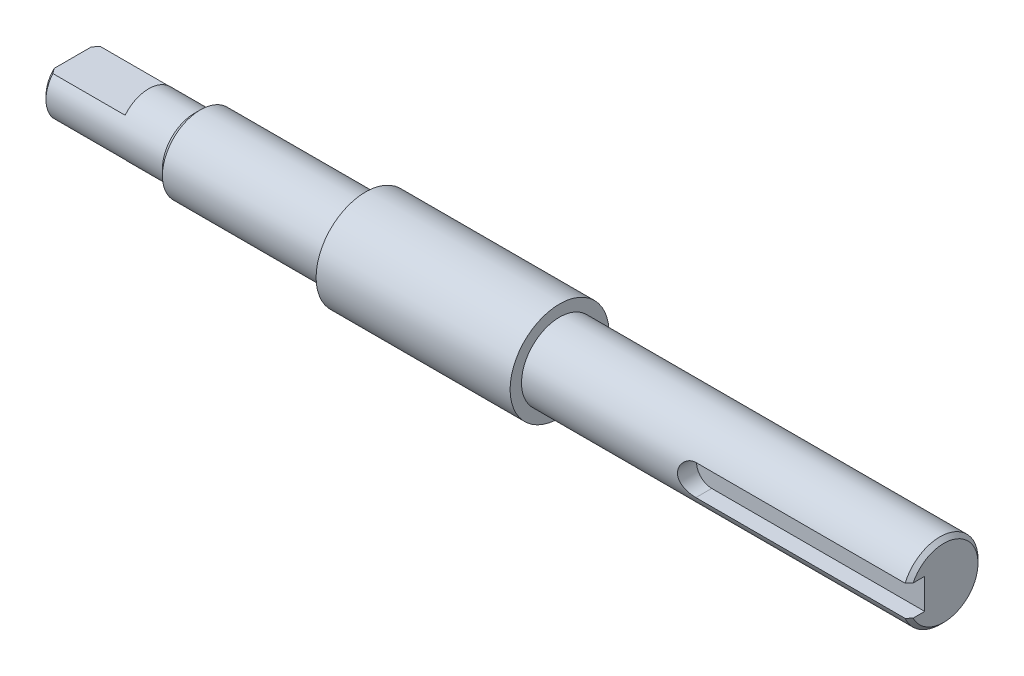
ISO-10303-21;
HEADER;
FILE_DESCRIPTION(('STEP AP214'),'2;1');
FILE_NAME('part.step','',(''),(''),'','','');
FILE_SCHEMA(('AUTOMOTIVE_DESIGN { 1 0 10303 214 1 1 1 1 }'));
ENDSEC;
DATA;
#1=APPLICATION_CONTEXT('core data for automotive mechanical design processes');
#2=APPLICATION_PROTOCOL_DEFINITION('international standard','automotive_design',2000,#1);
#3=PRODUCT_CONTEXT('',#1,'mechanical');
#4=PRODUCT('Part','Part','',(#3));
#5=PRODUCT_RELATED_PRODUCT_CATEGORY('part','',(#4));
#6=PRODUCT_DEFINITION_FORMATION('','',#4);
#7=PRODUCT_DEFINITION_CONTEXT('part definition',#1,'design');
#8=PRODUCT_DEFINITION('design','',#6,#7);
#9=PRODUCT_DEFINITION_SHAPE('','',#8);
#10=(LENGTH_UNIT() NAMED_UNIT(*) SI_UNIT(.MILLI.,.METRE.));
#11=(NAMED_UNIT(*) PLANE_ANGLE_UNIT() SI_UNIT($,.RADIAN.));
#12=(NAMED_UNIT(*) SI_UNIT($,.STERADIAN.) SOLID_ANGLE_UNIT());
#13=UNCERTAINTY_MEASURE_WITH_UNIT(LENGTH_MEASURE(1.E-05),#10,'distance_accuracy_value','');
#14=(GEOMETRIC_REPRESENTATION_CONTEXT(3) GLOBAL_UNCERTAINTY_ASSIGNED_CONTEXT((#13)) GLOBAL_UNIT_ASSIGNED_CONTEXT((#10,
#11,#12)) REPRESENTATION_CONTEXT('',''));
#15=CARTESIAN_POINT('',(0.,0.,0.));
#16=DIRECTION('',(0.,0.,1.));
#17=DIRECTION('',(1.,0.,0.));
#18=AXIS2_PLACEMENT_3D('',#15,#16,#17);
#19=CARTESIAN_POINT('',(-38.5,0.,0.));
#20=DIRECTION('',(1.,0.,0.));
#21=DIRECTION('',(0.,0.,-1.));
#22=AXIS2_PLACEMENT_3D('',#19,#20,#21);
#23=PLANE('',#22);
#24=DIRECTION('',(0.,0.,1.));
#25=VECTOR('',#24,1.);
#26=CARTESIAN_POINT('',(-38.5,2.52784493195291,-3.1));
#27=LINE('',#26,#25);
#28=CARTESIAN_POINT('',(-38.5,2.52784493195291,-2.42074368738205));
#29=VERTEX_POINT('',#28);
#30=CARTESIAN_POINT('',(-38.5,2.52784493195291,2.42074368738204));
#31=VERTEX_POINT('',#30);
#32=EDGE_CURVE('E156',#29,#31,#27,.T.);
#33=ORIENTED_EDGE('',*,*,#32,.F.);
#34=CARTESIAN_POINT('',(-38.5,0.,0.));
#35=DIRECTION('',(1.,0.,0.));
#36=DIRECTION('',(0.,0.,-1.));
#37=AXIS2_PLACEMENT_3D('',#34,#35,#36);
#38=CIRCLE('',#37,3.5);
#39=CARTESIAN_POINT('',(-38.5,-2.52784493195291,-2.42074368738205));
#40=VERTEX_POINT('',#39);
#41=EDGE_CURVE('E334',#29,#40,#38,.F.);
#42=ORIENTED_EDGE('',*,*,#41,.T.);
#43=DIRECTION('',(0.,0.,-1.));
#44=VECTOR('',#43,1.);
#45=CARTESIAN_POINT('',(-38.5,-2.52784493195291,-3.1));
#46=LINE('',#45,#44);
#47=CARTESIAN_POINT('',(-38.5,-2.52784493195291,2.42074368738204));
#48=VERTEX_POINT('',#47);
#49=EDGE_CURVE('E167',#48,#40,#46,.T.);
#50=ORIENTED_EDGE('',*,*,#49,.F.);
#51=CARTESIAN_POINT('',(-38.5,0.,0.));
#52=DIRECTION('',(1.,0.,0.));
#53=DIRECTION('',(0.,0.,-1.));
#54=AXIS2_PLACEMENT_3D('',#51,#52,#53);
#55=CIRCLE('',#54,3.5);
#56=EDGE_CURVE('E332',#48,#31,#55,.F.);
#57=ORIENTED_EDGE('',*,*,#56,.T.);
#58=EDGE_LOOP('',(#33,#42,#50,#57));
#59=FACE_BOUND('',#58,.T.);
#60=ADVANCED_FACE('F36',(#59),#23,.F.);
#61=CARTESIAN_POINT('',(-44.1944651384772,0.,0.));
#62=DIRECTION('',(-1.,0.,0.));
#63=DIRECTION('',(0.,0.,1.));
#64=AXIS2_PLACEMENT_3D('',#61,#62,#63);
#65=CYLINDRICAL_SURFACE('',#64,4.);
#66=DIRECTION('',(-1.,0.,0.));
#67=VECTOR('',#66,1.);
#68=CARTESIAN_POINT('',(-28.5,-2.52784493195291,-3.1));
#69=LINE('',#68,#67);
#70=CARTESIAN_POINT('',(-28.5,-2.52784493195291,-3.1));
#71=VERTEX_POINT('',#70);
#72=CARTESIAN_POINT('',(-38.,-2.52784493195291,-3.1));
#73=VERTEX_POINT('',#72);
#74=EDGE_CURVE('E177',#71,#73,#69,.T.);
#75=ORIENTED_EDGE('',*,*,#74,.T.);
#76=CARTESIAN_POINT('',(-38.,0.,0.));
#77=DIRECTION('',(1.,0.,0.));
#78=DIRECTION('',(0.,0.,-1.));
#79=AXIS2_PLACEMENT_3D('',#76,#77,#78);
#80=CIRCLE('',#79,4.);
#81=CARTESIAN_POINT('',(-38.,2.52784493195291,-3.1));
#82=VERTEX_POINT('',#81);
#83=EDGE_CURVE('E480',#73,#82,#80,.T.);
#84=ORIENTED_EDGE('',*,*,#83,.T.);
#85=DIRECTION('',(-1.,0.,0.));
#86=VECTOR('',#85,1.);
#87=CARTESIAN_POINT('',(-28.5,2.52784493195291,-3.1));
#88=LINE('',#87,#86);
#89=CARTESIAN_POINT('',(-28.5,2.52784493195291,-3.1));
#90=VERTEX_POINT('',#89);
#91=EDGE_CURVE('E161',#90,#82,#88,.T.);
#92=ORIENTED_EDGE('',*,*,#91,.F.);
#93=CARTESIAN_POINT('',(-28.5,0.,0.));
#94=DIRECTION('',(-1.,0.,0.));
#95=DIRECTION('',(0.,0.,1.));
#96=AXIS2_PLACEMENT_3D('',#93,#94,#95);
#97=CIRCLE('',#96,4.);
#98=CARTESIAN_POINT('',(-28.5,2.52784493195291,3.1));
#99=VERTEX_POINT('',#98);
#100=EDGE_CURVE('E157',#99,#90,#97,.T.);
#101=ORIENTED_EDGE('',*,*,#100,.F.);
#102=DIRECTION('',(-1.,0.,0.));
#103=VECTOR('',#102,1.);
#104=CARTESIAN_POINT('',(-28.5,2.52784493195291,3.1));
#105=LINE('',#104,#103);
#106=CARTESIAN_POINT('',(-38.,2.52784493195291,3.1));
#107=VERTEX_POINT('',#106);
#108=EDGE_CURVE('E164',#99,#107,#105,.T.);
#109=ORIENTED_EDGE('',*,*,#108,.T.);
#110=CARTESIAN_POINT('',(-38.,0.,0.));
#111=DIRECTION('',(1.,0.,0.));
#112=DIRECTION('',(0.,0.,-1.));
#113=AXIS2_PLACEMENT_3D('',#110,#111,#112);
#114=CIRCLE('',#113,4.);
#115=CARTESIAN_POINT('',(-38.,-2.52784493195291,3.1));
#116=VERTEX_POINT('',#115);
#117=EDGE_CURVE('E264',#107,#116,#114,.T.);
#118=ORIENTED_EDGE('',*,*,#117,.T.);
#119=DIRECTION('',(-1.,0.,0.));
#120=VECTOR('',#119,1.);
#121=CARTESIAN_POINT('',(-28.5,-2.52784493195291,3.1));
#122=LINE('',#121,#120);
#123=CARTESIAN_POINT('',(-28.5,-2.52784493195291,3.1));
#124=VERTEX_POINT('',#123);
#125=EDGE_CURVE('E174',#124,#116,#122,.T.);
#126=ORIENTED_EDGE('',*,*,#125,.F.);
#127=CARTESIAN_POINT('',(-28.5,0.,0.));
#128=DIRECTION('',(-1.,0.,0.));
#129=DIRECTION('',(0.,0.,1.));
#130=AXIS2_PLACEMENT_3D('',#127,#128,#129);
#131=CIRCLE('',#130,4.);
#132=EDGE_CURVE('E170',#71,#124,#131,.T.);
#133=ORIENTED_EDGE('',*,*,#132,.F.);
#134=EDGE_LOOP('',(#75,#84,#92,#101,#109,#118,#126,#133));
#135=FACE_BOUND('',#134,.T.);
#136=CARTESIAN_POINT('',(-22.5,0.,0.));
#137=DIRECTION('',(-1.,0.,0.));
#138=DIRECTION('',(0.,0.,1.));
#139=AXIS2_PLACEMENT_3D('',#136,#137,#138);
#140=CIRCLE('',#139,4.);
#141=CARTESIAN_POINT('',(-22.5,0.,4.));
#142=VERTEX_POINT('',#141);
#143=EDGE_CURVE('E132',#142,#142,#140,.T.);
#144=ORIENTED_EDGE('',*,*,#143,.T.);
#145=EDGE_LOOP('',(#144));
#146=FACE_BOUND('',#145,.T.);
#147=ADVANCED_FACE('F282',(#135,#146),#65,.T.);
#148=CARTESIAN_POINT('',(-22.5,4.,0.));
#149=DIRECTION('',(1.,0.,0.));
#150=DIRECTION('',(0.,0.,-1.));
#151=AXIS2_PLACEMENT_3D('',#148,#149,#150);
#152=PLANE('',#151);
#153=CARTESIAN_POINT('',(-22.5,0.,0.));
#154=DIRECTION('',(1.,0.,0.));
#155=DIRECTION('',(0.,0.,-1.));
#156=AXIS2_PLACEMENT_3D('',#153,#154,#155);
#157=CIRCLE('',#156,4.19999999999998);
#158=CARTESIAN_POINT('',(-22.5,0.,-4.19999999999998));
#159=VERTEX_POINT('',#158);
#160=EDGE_CURVE('E203',#159,#159,#157,.F.);
#161=ORIENTED_EDGE('',*,*,#160,.T.);
#162=EDGE_LOOP('',(#161));
#163=FACE_BOUND('',#162,.T.);
#164=ORIENTED_EDGE('',*,*,#143,.F.);
#165=EDGE_LOOP('',(#164));
#166=FACE_BOUND('',#165,.T.);
#167=ADVANCED_FACE('F287',(#163,#166),#152,.F.);
#168=CARTESIAN_POINT('',(-44.1944651384772,0.,0.));
#169=DIRECTION('',(-1.,0.,0.));
#170=DIRECTION('',(0.,0.,1.));
#171=AXIS2_PLACEMENT_3D('',#168,#169,#170);
#172=CYLINDRICAL_SURFACE('',#171,5.);
#173=CARTESIAN_POINT('',(-21.7,0.,0.));
#174=DIRECTION('',(1.,0.,0.));
#175=DIRECTION('',(0.,0.,-1.));
#176=AXIS2_PLACEMENT_3D('',#173,#174,#175);
#177=CIRCLE('',#176,5.);
#178=CARTESIAN_POINT('',(-21.7,0.,-5.));
#179=VERTEX_POINT('',#178);
#180=EDGE_CURVE('E337',#179,#179,#177,.T.);
#181=ORIENTED_EDGE('',*,*,#180,.T.);
#182=EDGE_LOOP('',(#181));
#183=FACE_BOUND('',#182,.T.);
#184=CARTESIAN_POINT('',(0.,0.,0.));
#185=DIRECTION('',(-1.,0.,0.));
#186=DIRECTION('',(0.,0.,1.));
#187=AXIS2_PLACEMENT_3D('',#184,#185,#186);
#188=CIRCLE('',#187,5.);
#189=CARTESIAN_POINT('',(0.,0.,5.));
#190=VERTEX_POINT('',#189);
#191=EDGE_CURVE('E191',#190,#190,#188,.T.);
#192=ORIENTED_EDGE('',*,*,#191,.T.);
#193=EDGE_LOOP('',(#192));
#194=FACE_BOUND('',#193,.T.);
#195=ADVANCED_FACE('F294',(#183,#194),#172,.T.);
#196=CARTESIAN_POINT('',(0.,6.5,0.));
#197=DIRECTION('',(1.,0.,0.));
#198=DIRECTION('',(0.,0.,-1.));
#199=AXIS2_PLACEMENT_3D('',#196,#197,#198);
#200=PLANE('',#199);
#201=ORIENTED_EDGE('',*,*,#191,.F.);
#202=EDGE_LOOP('',(#201));
#203=FACE_BOUND('',#202,.T.);
#204=CARTESIAN_POINT('',(0.,0.,0.));
#205=DIRECTION('',(-1.,0.,0.));
#206=DIRECTION('',(0.,0.,1.));
#207=AXIS2_PLACEMENT_3D('',#204,#205,#206);
#208=CIRCLE('',#207,6.5);
#209=CARTESIAN_POINT('',(0.,0.,6.5));
#210=VERTEX_POINT('',#209);
#211=EDGE_CURVE('E188',#210,#210,#208,.T.);
#212=ORIENTED_EDGE('',*,*,#211,.T.);
#213=EDGE_LOOP('',(#212));
#214=FACE_BOUND('',#213,.T.);
#215=ADVANCED_FACE('F298',(#203,#214),#200,.F.);
#216=CARTESIAN_POINT('',(-44.1944651384772,0.,0.));
#217=DIRECTION('',(-1.,0.,0.));
#218=DIRECTION('',(0.,0.,1.));
#219=AXIS2_PLACEMENT_3D('',#216,#217,#218);
#220=CYLINDRICAL_SURFACE('',#219,6.5);
#221=ORIENTED_EDGE('',*,*,#211,.F.);
#222=EDGE_LOOP('',(#221));
#223=FACE_BOUND('',#222,.T.);
#224=CARTESIAN_POINT('',(25.5,0.,0.));
#225=DIRECTION('',(-1.,0.,0.));
#226=DIRECTION('',(0.,0.,1.));
#227=AXIS2_PLACEMENT_3D('',#224,#225,#226);
#228=CIRCLE('',#227,6.5);
#229=CARTESIAN_POINT('',(25.5,0.,6.5));
#230=VERTEX_POINT('',#229);
#231=EDGE_CURVE('E185',#230,#230,#228,.T.);
#232=ORIENTED_EDGE('',*,*,#231,.T.);
#233=EDGE_LOOP('',(#232));
#234=FACE_BOUND('',#233,.T.);
#235=ADVANCED_FACE('F302',(#223,#234),#220,.T.);
#236=CARTESIAN_POINT('',(25.5,6.5,0.));
#237=DIRECTION('',(-1.,0.,0.));
#238=DIRECTION('',(0.,0.,1.));
#239=AXIS2_PLACEMENT_3D('',#236,#237,#238);
#240=PLANE('',#239);
#241=ORIENTED_EDGE('',*,*,#231,.F.);
#242=EDGE_LOOP('',(#241));
#243=FACE_BOUND('',#242,.T.);
#244=CARTESIAN_POINT('',(25.5,0.,0.));
#245=DIRECTION('',(-1.,0.,0.));
#246=DIRECTION('',(0.,0.,1.));
#247=AXIS2_PLACEMENT_3D('',#244,#245,#246);
#248=CIRCLE('',#247,5.);
#249=CARTESIAN_POINT('',(25.5,0.,5.));
#250=VERTEX_POINT('',#249);
#251=EDGE_CURVE('E180',#250,#250,#248,.T.);
#252=ORIENTED_EDGE('',*,*,#251,.T.);
#253=EDGE_LOOP('',(#252));
#254=FACE_BOUND('',#253,.T.);
#255=ADVANCED_FACE('F279',(#243,#254),#240,.F.);
#256=CARTESIAN_POINT('',(-44.1944651384772,0.,0.));
#257=DIRECTION('',(-1.,0.,0.));
#258=DIRECTION('',(0.,0.,1.));
#259=AXIS2_PLACEMENT_3D('',#256,#257,#258);
#260=CYLINDRICAL_SURFACE('',#259,5.);
#261=ORIENTED_EDGE('',*,*,#251,.F.);
#262=EDGE_LOOP('',(#261));
#263=FACE_BOUND('',#262,.T.);
#264=DIRECTION('',(-1.,0.,0.));
#265=VECTOR('',#264,1.);
#266=CARTESIAN_POINT('',(-44.1944651384772,1.99999999999999,4.58257569495584));
#267=LINE('',#266,#265);
#268=CARTESIAN_POINT('',(48.,2.,4.58257569495584));
#269=VERTEX_POINT('',#268);
#270=CARTESIAN_POINT('',(75.5,1.99999999999999,4.58257569495584));
#271=VERTEX_POINT('',#270);
#272=EDGE_CURVE('E150',#269,#271,#267,.F.);
#273=ORIENTED_EDGE('',*,*,#272,.T.);
#274=CARTESIAN_POINT('',(75.5,0.,0.));
#275=DIRECTION('',(-1.,0.,0.));
#276=DIRECTION('',(0.,0.,1.));
#277=AXIS2_PLACEMENT_3D('',#274,#275,#276);
#278=CIRCLE('',#277,5.);
#279=CARTESIAN_POINT('',(75.5,-2.,4.58257569495584));
#280=VERTEX_POINT('',#279);
#281=EDGE_CURVE('E245',#271,#280,#278,.T.);
#282=ORIENTED_EDGE('',*,*,#281,.T.);
#283=DIRECTION('',(-1.,0.,0.));
#284=VECTOR('',#283,1.);
#285=CARTESIAN_POINT('',(-44.1944651384772,-2.,4.58257569495584));
#286=LINE('',#285,#284);
#287=CARTESIAN_POINT('',(48.,-2.,4.58257569495584));
#288=VERTEX_POINT('',#287);
#289=EDGE_CURVE('E153',#280,#288,#286,.T.);
#290=ORIENTED_EDGE('',*,*,#289,.T.);
#291=CARTESIAN_POINT('',(48.,-2.,4.58257569495584));
#292=CARTESIAN_POINT('',(47.9461941474974,-2.00000798036348,4.58256464470381));
#293=CARTESIAN_POINT('',(47.8923943344424,-1.99782891366025,4.58352306077322));
#294=CARTESIAN_POINT('',(47.7852287017453,-1.98915905973447,4.58729625417543));
#295=CARTESIAN_POINT('',(47.731862724644,-1.98266991468793,4.59011032448545));
#296=CARTESIAN_POINT('',(47.6261531784412,-1.9654760367637,4.59749782920639));
#297=CARTESIAN_POINT('',(47.573806415956,-1.95478796820434,4.60206430717532));
#298=CARTESIAN_POINT('',(47.4702992282856,-1.92931630190661,4.61280053296682));
#299=CARTESIAN_POINT('',(47.4191388757229,-1.91453245417091,4.61897037865398));
#300=CARTESIAN_POINT('',(47.2680641494181,-1.86426971793523,4.63959291248421));
#301=CARTESIAN_POINT('',(47.1703457693103,-1.82284489460008,4.6561744915743));
#302=CARTESIAN_POINT('',(46.9832044199174,-1.72548191592177,4.6931237076538));
#303=CARTESIAN_POINT('',(46.8937894470384,-1.66952996336926,4.71349493864007));
#304=CARTESIAN_POINT('',(46.7207376033258,-1.54131835736856,4.75700999402114));
#305=CARTESIAN_POINT('',(46.6376327830798,-1.46836913992731,4.78024245635516));
#306=CARTESIAN_POINT('',(46.4844597277893,-1.3096964617621,4.82612790548655));
#307=CARTESIAN_POINT('',(46.4143941691343,-1.22397038499683,4.8487807724972));
#308=CARTESIAN_POINT('',(46.2865936058044,-1.0380059080897,4.89203417106082));
#309=CARTESIAN_POINT('',(46.2294551907381,-0.937327933050974,4.91251824543531));
#310=CARTESIAN_POINT('',(46.1331559273114,-0.726824143246722,4.94803944125003));
#311=CARTESIAN_POINT('',(46.0939875759483,-0.617002169026255,4.96307883544185));
#312=CARTESIAN_POINT('',(46.0366587986894,-0.3969674412957,4.98538314653816));
#313=CARTESIAN_POINT('',(46.0175730490944,-0.287031054523069,4.99298922547927));
#314=CARTESIAN_POINT('',(45.9979715200544,-0.0652684304565252,5.00080310201086));
#315=CARTESIAN_POINT('',(45.9974491619765,0.0465571232841555,5.0010135205303));
#316=CARTESIAN_POINT('',(46.0144828391599,0.262233376226775,4.99421960045302));
#317=CARTESIAN_POINT('',(46.031025046674,0.366179202506782,4.98761985585461));
#318=CARTESIAN_POINT('',(46.0799934270535,0.569674786500921,4.96849270441446));
#319=CARTESIAN_POINT('',(46.1124204988686,0.669224295072834,4.95596496209929));
#320=CARTESIAN_POINT('',(46.1926362964245,0.862897539070286,4.92596830598785));
#321=CARTESIAN_POINT('',(46.2406492408105,0.956916851366429,4.90842774755848));
#322=CARTESIAN_POINT('',(46.3504645885952,1.13580746919775,4.87014602008043));
#323=CARTESIAN_POINT('',(46.4122718296906,1.22067554984697,4.84940372896449));
#324=CARTESIAN_POINT('',(46.5526441802585,1.38476339273626,4.80521782746144));
#325=CARTESIAN_POINT('',(46.63204247467,1.46324770308939,4.78168627172885));
#326=CARTESIAN_POINT('',(46.8029800951477,1.60609926099477,4.7356195058465));
#327=CARTESIAN_POINT('',(46.8945249220943,1.67046007709005,4.71308475332783));
#328=CARTESIAN_POINT('',(47.0904702840212,1.78493657933605,4.67095688856025));
#329=CARTESIAN_POINT('',(47.1951648366602,1.83458932217621,4.65146702150583));
#330=CARTESIAN_POINT('',(47.4123615244295,1.91521298357264,4.61886105059582));
#331=CARTESIAN_POINT('',(47.5248494473383,1.94621696002207,4.60573367628738));
#332=CARTESIAN_POINT('',(47.698743634158,1.9781058182572,4.59208303529493));
#333=CARTESIAN_POINT('',(47.7586575493013,1.98630505165979,4.58853437680526));
#334=CARTESIAN_POINT('',(47.8790350189956,1.99725282103811,4.58377540314389));
#335=CARTESIAN_POINT('',(47.9394982117579,2.00000471568568,4.58256364711745));
#336=CARTESIAN_POINT('',(48.,2.,4.58257569495584));
#337=B_SPLINE_CURVE_WITH_KNOTS('',3,(#291,#292,#293,#294,#295,#296,#297,#298,#299,#300,#301,
#302,#303,#304,#305,#306,#307,#308,#309,#310,#311,#312,#313,#314,#315,#316,#317,#318,#319,#320,
#321,#322,#323,#324,#325,#326,#327,#328,#329,#330,#331,#332,#333,#334,#335,#336),.UNSPECIFIED.,
.F.,.F.,(4,2,2,2,2,2,2,2,2,2,2,2,2,2,2,2,2,2,2,2,2,2,4),(0.,0.161354853098824,0.322648263883208,
0.483307911251876,0.643977367092303,0.964683001739086,1.28569434942625,1.62318047995497,
1.9607358053919,2.31162858925763,2.66237473197322,2.99613876504269,3.32978451514655,
3.64468915259534,3.95961161305654,4.27928176927546,4.59906421133018,4.93981874675152,
5.28072813203933,5.63144241548461,5.98153315592124,6.16300192557814,6.34435877193561),.UNSPECIFIED.);
#338=EDGE_CURVE('E131',#288,#269,#337,.T.);
#339=ORIENTED_EDGE('',*,*,#338,.T.);
#340=EDGE_LOOP('',(#273,#282,#290,#339));
#341=FACE_BOUND('',#340,.T.);
#342=ADVANCED_FACE('F205',(#263,#341),#260,.T.);
#343=CARTESIAN_POINT('',(76.,5.,0.));
#344=DIRECTION('',(-1.,0.,0.));
#345=DIRECTION('',(0.,0.,1.));
#346=AXIS2_PLACEMENT_3D('',#343,#344,#345);
#347=PLANE('',#346);
#348=DIRECTION('',(0.,0.,1.));
#349=VECTOR('',#348,1.);
#350=CARTESIAN_POINT('',(76.,-2.,2.5));
#351=LINE('',#350,#349);
#352=CARTESIAN_POINT('',(76.,-2.,2.5));
#353=VERTEX_POINT('',#352);
#354=CARTESIAN_POINT('',(76.,-2.,4.03112887414928));
#355=VERTEX_POINT('',#354);
#356=EDGE_CURVE('E154',#353,#355,#351,.T.);
#357=ORIENTED_EDGE('',*,*,#356,.T.);
#358=CARTESIAN_POINT('',(76.,0.,0.));
#359=DIRECTION('',(-1.,0.,0.));
#360=DIRECTION('',(0.,0.,1.));
#361=AXIS2_PLACEMENT_3D('',#358,#359,#360);
#362=CIRCLE('',#361,4.5);
#363=CARTESIAN_POINT('',(76.,2.,4.03112887414928));
#364=VERTEX_POINT('',#363);
#365=EDGE_CURVE('E49',#355,#364,#362,.F.);
#366=ORIENTED_EDGE('',*,*,#365,.T.);
#367=DIRECTION('',(0.,0.,1.));
#368=VECTOR('',#367,1.);
#369=CARTESIAN_POINT('',(76.,2.,2.5));
#370=LINE('',#369,#368);
#371=CARTESIAN_POINT('',(76.,2.,2.5));
#372=VERTEX_POINT('',#371);
#373=EDGE_CURVE('E136',#372,#364,#370,.T.);
#374=ORIENTED_EDGE('',*,*,#373,.F.);
#375=DIRECTION('',(0.,1.,0.));
#376=VECTOR('',#375,1.);
#377=CARTESIAN_POINT('',(76.,5.,2.5));
#378=LINE('',#377,#376);
#379=EDGE_CURVE('E124',#353,#372,#378,.T.);
#380=ORIENTED_EDGE('',*,*,#379,.F.);
#381=EDGE_LOOP('',(#357,#366,#374,#380));
#382=FACE_BOUND('',#381,.T.);
#383=ADVANCED_FACE('F143',(#382),#347,.F.);
#384=CARTESIAN_POINT('',(-28.5,-2.52784493195291,-3.1));
#385=DIRECTION('',(0.,1.,0.));
#386=DIRECTION('',(0.,0.,1.));
#387=AXIS2_PLACEMENT_3D('',#384,#385,#386);
#388=PLANE('',#387);
#389=ORIENTED_EDGE('',*,*,#49,.T.);
#390=CARTESIAN_POINT('',(-38.5,-2.52784493195291,-2.42074368738204));
#391=CARTESIAN_POINT('',(-38.4600047721838,-2.52784493195291,-2.47856292534061));
#392=CARTESIAN_POINT('',(-38.4195122650444,-2.52784493195291,-2.53603534659571));
#393=CARTESIAN_POINT('',(-38.3376610836858,-2.52784493195291,-2.65034469361215));
#394=CARTESIAN_POINT('',(-38.2963025681697,-2.52784493195291,-2.70718173293418));
#395=CARTESIAN_POINT('',(-38.2128346405951,-2.52784493195291,-2.82029738120061));
#396=CARTESIAN_POINT('',(-38.1707252555723,-2.52784493195291,-2.87657601013795));
#397=CARTESIAN_POINT('',(-38.0858386714917,-2.52784493195291,-2.98864369868627));
#398=CARTESIAN_POINT('',(-38.0430613525939,-2.52784493195291,-3.0444326675717));
#399=CARTESIAN_POINT('',(-38.,-2.52784493195291,-3.1));
#400=B_SPLINE_CURVE_WITH_KNOTS('',3,(#390,#391,#392,#393,#394,#395,#396,#397,#398,#399),
.UNSPECIFIED.,.F.,.F.,(4,2,2,2,4),(0.,0.210906678483617,0.421775039131133,0.632635822549874,
0.843534883310969),.UNSPECIFIED.);
#401=EDGE_CURVE('E258',#40,#73,#400,.T.);
#402=ORIENTED_EDGE('',*,*,#401,.T.);
#403=ORIENTED_EDGE('',*,*,#74,.F.);
#404=DIRECTION('',(0.,0.,-1.));
#405=VECTOR('',#404,1.);
#406=CARTESIAN_POINT('',(-28.5,-2.52784493195291,-3.1));
#407=LINE('',#406,#405);
#408=EDGE_CURVE('E172',#124,#71,#407,.T.);
#409=ORIENTED_EDGE('',*,*,#408,.F.);
#410=ORIENTED_EDGE('',*,*,#125,.T.);
#411=CARTESIAN_POINT('',(-38.,-2.52784493195291,3.1));
#412=CARTESIAN_POINT('',(-38.0430613525939,-2.52784493195291,3.0444326675717));
#413=CARTESIAN_POINT('',(-38.0858386714917,-2.52784493195291,2.98864369868627));
#414=CARTESIAN_POINT('',(-38.1707252555723,-2.52784493195291,2.87657601013795));
#415=CARTESIAN_POINT('',(-38.2128346405951,-2.52784493195291,2.82029738120061));
#416=CARTESIAN_POINT('',(-38.2963025681697,-2.52784493195291,2.70718173293418));
#417=CARTESIAN_POINT('',(-38.3376610836858,-2.52784493195291,2.65034469361215));
#418=CARTESIAN_POINT('',(-38.4195122650444,-2.52784493195291,2.53603534659571));
#419=CARTESIAN_POINT('',(-38.4600047721838,-2.52784493195291,2.47856292534061));
#420=CARTESIAN_POINT('',(-38.5,-2.52784493195291,2.42074368738204));
#421=B_SPLINE_CURVE_WITH_KNOTS('',3,(#411,#412,#413,#414,#415,#416,#417,#418,#419,#420),
.UNSPECIFIED.,.F.,.F.,(4,2,2,2,4),(0.,0.210899060761094,0.421759844179836,0.632628204827351,
0.843534883310969),.UNSPECIFIED.);
#422=EDGE_CURVE('E265',#116,#48,#421,.T.);
#423=ORIENTED_EDGE('',*,*,#422,.T.);
#424=EDGE_LOOP('',(#389,#402,#403,#409,#410,#423));
#425=FACE_BOUND('',#424,.T.);
#426=ADVANCED_FACE('F270',(#425),#388,.F.);
#427=CARTESIAN_POINT('',(-28.5,0.,0.));
#428=DIRECTION('',(-1.,0.,0.));
#429=DIRECTION('',(0.,0.,1.));
#430=AXIS2_PLACEMENT_3D('',#427,#428,#429);
#431=PLANE('',#430);
#432=ORIENTED_EDGE('',*,*,#132,.T.);
#433=ORIENTED_EDGE('',*,*,#408,.T.);
#434=EDGE_LOOP('',(#432,#433));
#435=FACE_BOUND('',#434,.T.);
#436=ADVANCED_FACE('F228',(#435),#431,.T.);
#437=CARTESIAN_POINT('',(-28.5,2.52784493195291,-3.1));
#438=DIRECTION('',(0.,-1.,0.));
#439=DIRECTION('',(0.,0.,-1.));
#440=AXIS2_PLACEMENT_3D('',#437,#438,#439);
#441=PLANE('',#440);
#442=ORIENTED_EDGE('',*,*,#91,.T.);
#443=CARTESIAN_POINT('',(-38.,2.52784493195291,-3.1));
#444=CARTESIAN_POINT('',(-38.0430613525939,2.52784493195291,-3.0444326675717));
#445=CARTESIAN_POINT('',(-38.0858386714917,2.52784493195291,-2.98864369868627));
#446=CARTESIAN_POINT('',(-38.1707252555723,2.52784493195291,-2.87657601013795));
#447=CARTESIAN_POINT('',(-38.2128346405951,2.52784493195291,-2.82029738120061));
#448=CARTESIAN_POINT('',(-38.2963025681697,2.52784493195291,-2.70718173293418));
#449=CARTESIAN_POINT('',(-38.3376610836858,2.52784493195291,-2.65034469361215));
#450=CARTESIAN_POINT('',(-38.4195122650444,2.52784493195291,-2.53603534659571));
#451=CARTESIAN_POINT('',(-38.4600047721838,2.52784493195291,-2.47856292534061));
#452=CARTESIAN_POINT('',(-38.5,2.52784493195291,-2.42074368738204));
#453=B_SPLINE_CURVE_WITH_KNOTS('',3,(#443,#444,#445,#446,#447,#448,#449,#450,#451,#452),
.UNSPECIFIED.,.F.,.F.,(4,2,2,2,4),(0.,0.210899060761094,0.421759844179836,0.632628204827351,
0.843534883310969),.UNSPECIFIED.);
#454=EDGE_CURVE('E239',#82,#29,#453,.T.);
#455=ORIENTED_EDGE('',*,*,#454,.T.);
#456=ORIENTED_EDGE('',*,*,#32,.T.);
#457=CARTESIAN_POINT('',(-38.5,2.52784493195291,2.42074368738204));
#458=CARTESIAN_POINT('',(-38.4600047721838,2.52784493195291,2.47856292534061));
#459=CARTESIAN_POINT('',(-38.4195122650444,2.52784493195291,2.53603534659571));
#460=CARTESIAN_POINT('',(-38.3376610836858,2.52784493195291,2.65034469361215));
#461=CARTESIAN_POINT('',(-38.2963025681697,2.52784493195291,2.70718173293418));
#462=CARTESIAN_POINT('',(-38.2128346405951,2.52784493195291,2.82029738120061));
#463=CARTESIAN_POINT('',(-38.1707252555723,2.52784493195291,2.87657601013795));
#464=CARTESIAN_POINT('',(-38.0858386714917,2.52784493195291,2.98864369868627));
#465=CARTESIAN_POINT('',(-38.0430613525939,2.52784493195291,3.0444326675717));
#466=CARTESIAN_POINT('',(-38.,2.52784493195291,3.1));
#467=B_SPLINE_CURVE_WITH_KNOTS('',3,(#457,#458,#459,#460,#461,#462,#463,#464,#465,#466),
.UNSPECIFIED.,.F.,.F.,(4,2,2,2,4),(0.,0.210906678483617,0.421775039131133,0.632635822549874,
0.843534883310969),.UNSPECIFIED.);
#468=EDGE_CURVE('E233',#31,#107,#467,.T.);
#469=ORIENTED_EDGE('',*,*,#468,.T.);
#470=ORIENTED_EDGE('',*,*,#108,.F.);
#471=DIRECTION('',(0.,0.,1.));
#472=VECTOR('',#471,1.);
#473=CARTESIAN_POINT('',(-28.5,2.52784493195291,-3.1));
#474=LINE('',#473,#472);
#475=EDGE_CURVE('E159',#90,#99,#474,.T.);
#476=ORIENTED_EDGE('',*,*,#475,.F.);
#477=EDGE_LOOP('',(#442,#455,#456,#469,#470,#476));
#478=FACE_BOUND('',#477,.T.);
#479=ADVANCED_FACE('F223',(#478),#441,.F.);
#480=CARTESIAN_POINT('',(-28.5,0.,0.));
#481=DIRECTION('',(-1.,0.,0.));
#482=DIRECTION('',(0.,0.,1.));
#483=AXIS2_PLACEMENT_3D('',#480,#481,#482);
#484=PLANE('',#483);
#485=ORIENTED_EDGE('',*,*,#100,.T.);
#486=ORIENTED_EDGE('',*,*,#475,.T.);
#487=EDGE_LOOP('',(#485,#486));
#488=FACE_BOUND('',#487,.T.);
#489=ADVANCED_FACE('F214',(#488),#484,.T.);
#490=CARTESIAN_POINT('',(48.,0.,2.5));
#491=DIRECTION('',(0.,0.,1.));
#492=DIRECTION('',(1.,0.,0.));
#493=AXIS2_PLACEMENT_3D('',#490,#491,#492);
#494=CYLINDRICAL_SURFACE('',#493,2.);
#495=DIRECTION('',(0.,0.,1.));
#496=VECTOR('',#495,1.);
#497=CARTESIAN_POINT('',(48.,-2.,2.5));
#498=LINE('',#497,#496);
#499=CARTESIAN_POINT('',(48.,-2.,2.5));
#500=VERTEX_POINT('',#499);
#501=EDGE_CURVE('E145',#500,#288,#498,.T.);
#502=ORIENTED_EDGE('',*,*,#501,.F.);
#503=CARTESIAN_POINT('',(48.,0.,2.5));
#504=DIRECTION('',(0.,0.,1.));
#505=DIRECTION('',(1.,0.,0.));
#506=AXIS2_PLACEMENT_3D('',#503,#504,#505);
#507=CIRCLE('',#506,2.);
#508=CARTESIAN_POINT('',(48.,2.,2.5));
#509=VERTEX_POINT('',#508);
#510=EDGE_CURVE('E141',#509,#500,#507,.T.);
#511=ORIENTED_EDGE('',*,*,#510,.F.);
#512=DIRECTION('',(0.,0.,1.));
#513=VECTOR('',#512,1.);
#514=CARTESIAN_POINT('',(48.,2.,2.5));
#515=LINE('',#514,#513);
#516=EDGE_CURVE('E139',#509,#269,#515,.T.);
#517=ORIENTED_EDGE('',*,*,#516,.T.);
#518=ORIENTED_EDGE('',*,*,#338,.F.);
#519=EDGE_LOOP('',(#502,#511,#517,#518));
#520=FACE_BOUND('',#519,.T.);
#521=ADVANCED_FACE('F209',(#520),#494,.F.);
#522=CARTESIAN_POINT('',(76.,-2.,2.5));
#523=DIRECTION('',(0.,-1.,0.));
#524=DIRECTION('',(0.,0.,-1.));
#525=AXIS2_PLACEMENT_3D('',#522,#523,#524);
#526=PLANE('',#525);
#527=ORIENTED_EDGE('',*,*,#289,.F.);
#528=CARTESIAN_POINT('',(75.5,-2.,4.58257569495584));
#529=CARTESIAN_POINT('',(75.5419124295061,-2.,4.53684512327981));
#530=CARTESIAN_POINT('',(75.5837706865717,-2.,4.4910648538992));
#531=CARTESIAN_POINT('',(75.6673679301638,-2.,4.39939622920809));
#532=CARTESIAN_POINT('',(75.7091069176462,-2.,4.35350787476923));
#533=CARTESIAN_POINT('',(75.7924554201815,-2.,4.26161359983418));
#534=CARTESIAN_POINT('',(75.8340649350799,-2.,4.21560767919779));
#535=CARTESIAN_POINT('',(75.9171421102884,-2.,4.12346727656414));
#536=CARTESIAN_POINT('',(75.9586097694553,-2.,4.07733279353623));
#537=CARTESIAN_POINT('',(76.,-2.,4.03112887414928));
#538=B_SPLINE_CURVE_WITH_KNOTS('',3,(#528,#529,#530,#531,#532,#533,#534,#535,#536,#537),
.UNSPECIFIED.,.F.,.F.,(4,2,2,2,4),(0.,0.186095231389279,0.372188967110217,0.558282924839071,
0.744378378749964),.UNSPECIFIED.);
#539=EDGE_CURVE('E63',#280,#355,#538,.T.);
#540=ORIENTED_EDGE('',*,*,#539,.T.);
#541=ORIENTED_EDGE('',*,*,#356,.F.);
#542=DIRECTION('',(1.,0.,0.));
#543=VECTOR('',#542,1.);
#544=CARTESIAN_POINT('',(76.,-2.,2.5));
#545=LINE('',#544,#543);
#546=EDGE_CURVE('E130',#500,#353,#545,.T.);
#547=ORIENTED_EDGE('',*,*,#546,.F.);
#548=ORIENTED_EDGE('',*,*,#501,.T.);
#549=EDGE_LOOP('',(#527,#540,#541,#547,#548));
#550=FACE_BOUND('',#549,.T.);
#551=ADVANCED_FACE('F213',(#550),#526,.F.);
#552=CARTESIAN_POINT('',(76.,2.,2.5));
#553=DIRECTION('',(0.,1.,0.));
#554=DIRECTION('',(-1.,0.,0.));
#555=AXIS2_PLACEMENT_3D('',#552,#553,#554);
#556=PLANE('',#555);
#557=ORIENTED_EDGE('',*,*,#373,.T.);
#558=CARTESIAN_POINT('',(76.,2.,4.03112887414928));
#559=CARTESIAN_POINT('',(75.9586097694553,2.,4.07733279353623));
#560=CARTESIAN_POINT('',(75.9171421102883,2.,4.12346727656414));
#561=CARTESIAN_POINT('',(75.8340649350799,2.,4.21560767919779));
#562=CARTESIAN_POINT('',(75.7924554201815,2.,4.26161359983418));
#563=CARTESIAN_POINT('',(75.7091069176462,2.,4.35350787476924));
#564=CARTESIAN_POINT('',(75.6673679301638,2.,4.39939622920809));
#565=CARTESIAN_POINT('',(75.5837706865717,2.,4.49106485389921));
#566=CARTESIAN_POINT('',(75.5419124295061,2.,4.53684512327982));
#567=CARTESIAN_POINT('',(75.5,2.,4.58257569495585));
#568=B_SPLINE_CURVE_WITH_KNOTS('',3,(#558,#559,#560,#561,#562,#563,#564,#565,#566,#567),
.UNSPECIFIED.,.F.,.F.,(4,2,2,2,4),(0.,0.186095453910902,0.372189411639746,0.558283147360685,
0.744378378749966),.UNSPECIFIED.);
#569=EDGE_CURVE('E11',#364,#271,#568,.T.);
#570=ORIENTED_EDGE('',*,*,#569,.T.);
#571=ORIENTED_EDGE('',*,*,#272,.F.);
#572=ORIENTED_EDGE('',*,*,#516,.F.);
#573=DIRECTION('',(-1.,0.,0.));
#574=VECTOR('',#573,1.);
#575=CARTESIAN_POINT('',(76.,2.,2.5));
#576=LINE('',#575,#574);
#577=EDGE_CURVE('E128',#372,#509,#576,.T.);
#578=ORIENTED_EDGE('',*,*,#577,.F.);
#579=EDGE_LOOP('',(#557,#570,#571,#572,#578));
#580=FACE_BOUND('',#579,.T.);
#581=ADVANCED_FACE('F135',(#580),#556,.F.);
#582=CARTESIAN_POINT('',(76.,0.,2.5));
#583=DIRECTION('',(0.,0.,1.));
#584=DIRECTION('',(1.,0.,0.));
#585=AXIS2_PLACEMENT_3D('',#582,#583,#584);
#586=PLANE('',#585);
#587=ORIENTED_EDGE('',*,*,#379,.T.);
#588=ORIENTED_EDGE('',*,*,#577,.T.);
#589=ORIENTED_EDGE('',*,*,#510,.T.);
#590=ORIENTED_EDGE('',*,*,#546,.T.);
#591=EDGE_LOOP('',(#587,#588,#589,#590));
#592=FACE_BOUND('',#591,.T.);
#593=ADVANCED_FACE('F126',(#592),#586,.T.);
#594=CARTESIAN_POINT('',(-22.5,0.,0.));
#595=DIRECTION('',(1.,0.,0.));
#596=DIRECTION('',(0.,0.,-1.));
#597=AXIS2_PLACEMENT_3D('',#594,#595,#596);
#598=CONICAL_SURFACE('',#597,4.19999999999998,0.785398163397448);
#599=CARTESIAN_POINT('',(-21.7,0.,-5.));
#600=CARTESIAN_POINT('',(-21.7083333333333,0.,-4.99166666666666));
#601=CARTESIAN_POINT('',(-21.7166666666666,0.,-4.98333333333333));
#602=CARTESIAN_POINT('',(-21.7333333333333,0.,-4.96666666666666));
#603=CARTESIAN_POINT('',(-21.7416666666666,0.,-4.95833333333333));
#604=CARTESIAN_POINT('',(-21.7583333333333,0.,-4.94166666666666));
#605=CARTESIAN_POINT('',(-21.7666666666666,0.,-4.93333333333333));
#606=CARTESIAN_POINT('',(-21.7833333333333,0.,-4.91666666666666));
#607=CARTESIAN_POINT('',(-21.7916666666667,0.,-4.90833333333333));
#608=CARTESIAN_POINT('',(-21.8083333333333,0.,-4.89166666666666));
#609=CARTESIAN_POINT('',(-21.8166666666667,0.,-4.88333333333333));
#610=CARTESIAN_POINT('',(-21.8333333333333,0.,-4.86666666666666));
#611=CARTESIAN_POINT('',(-21.8416666666667,0.,-4.85833333333333));
#612=CARTESIAN_POINT('',(-21.8583333333333,0.,-4.84166666666666));
#613=CARTESIAN_POINT('',(-21.8666666666667,0.,-4.83333333333333));
#614=CARTESIAN_POINT('',(-21.8833333333333,0.,-4.81666666666666));
#615=CARTESIAN_POINT('',(-21.8916666666667,0.,-4.80833333333333));
#616=CARTESIAN_POINT('',(-21.9083333333333,0.,-4.79166666666666));
#617=CARTESIAN_POINT('',(-21.9166666666667,0.,-4.78333333333333));
#618=CARTESIAN_POINT('',(-21.9333333333333,0.,-4.76666666666666));
#619=CARTESIAN_POINT('',(-21.9416666666667,0.,-4.75833333333333));
#620=CARTESIAN_POINT('',(-21.9583333333333,0.,-4.74166666666666));
#621=CARTESIAN_POINT('',(-21.9666666666667,0.,-4.73333333333333));
#622=CARTESIAN_POINT('',(-21.9833333333333,0.,-4.71666666666666));
#623=CARTESIAN_POINT('',(-21.9916666666667,0.,-4.70833333333333));
#624=CARTESIAN_POINT('',(-22.0083333333333,0.,-4.69166666666666));
#625=CARTESIAN_POINT('',(-22.0166666666667,0.,-4.68333333333332));
#626=CARTESIAN_POINT('',(-22.0333333333333,0.,-4.66666666666666));
#627=CARTESIAN_POINT('',(-22.0416666666667,0.,-4.65833333333332));
#628=CARTESIAN_POINT('',(-22.0583333333333,0.,-4.64166666666666));
#629=CARTESIAN_POINT('',(-22.0666666666667,0.,-4.63333333333332));
#630=CARTESIAN_POINT('',(-22.0833333333333,0.,-4.61666666666666));
#631=CARTESIAN_POINT('',(-22.0916666666667,0.,-4.60833333333332));
#632=CARTESIAN_POINT('',(-22.1083333333333,0.,-4.59166666666666));
#633=CARTESIAN_POINT('',(-22.1166666666667,0.,-4.58333333333332));
#634=CARTESIAN_POINT('',(-22.1333333333333,0.,-4.56666666666666));
#635=CARTESIAN_POINT('',(-22.1416666666667,0.,-4.55833333333332));
#636=CARTESIAN_POINT('',(-22.1583333333333,0.,-4.54166666666665));
#637=CARTESIAN_POINT('',(-22.1666666666667,0.,-4.53333333333332));
#638=CARTESIAN_POINT('',(-22.1833333333333,0.,-4.51666666666665));
#639=CARTESIAN_POINT('',(-22.1916666666667,0.,-4.50833333333332));
#640=CARTESIAN_POINT('',(-22.2083333333333,0.,-4.49166666666665));
#641=CARTESIAN_POINT('',(-22.2166666666667,0.,-4.48333333333332));
#642=CARTESIAN_POINT('',(-22.2333333333333,0.,-4.46666666666665));
#643=CARTESIAN_POINT('',(-22.2416666666667,0.,-4.45833333333332));
#644=CARTESIAN_POINT('',(-22.2583333333333,0.,-4.44166666666665));
#645=CARTESIAN_POINT('',(-22.2666666666667,0.,-4.43333333333332));
#646=CARTESIAN_POINT('',(-22.2833333333333,0.,-4.41666666666665));
#647=CARTESIAN_POINT('',(-22.2916666666667,0.,-4.40833333333332));
#648=CARTESIAN_POINT('',(-22.3083333333333,0.,-4.39166666666665));
#649=CARTESIAN_POINT('',(-22.3166666666667,0.,-4.38333333333332));
#650=CARTESIAN_POINT('',(-22.3333333333333,0.,-4.36666666666665));
#651=CARTESIAN_POINT('',(-22.3416666666667,0.,-4.35833333333332));
#652=CARTESIAN_POINT('',(-22.3583333333333,0.,-4.34166666666665));
#653=CARTESIAN_POINT('',(-22.3666666666667,0.,-4.33333333333332));
#654=CARTESIAN_POINT('',(-22.3833333333333,0.,-4.31666666666665));
#655=CARTESIAN_POINT('',(-22.3916666666667,0.,-4.30833333333331));
#656=CARTESIAN_POINT('',(-22.4083333333333,0.,-4.29166666666665));
#657=CARTESIAN_POINT('',(-22.4166666666667,0.,-4.28333333333332));
#658=CARTESIAN_POINT('',(-22.4333333333333,0.,-4.26666666666665));
#659=CARTESIAN_POINT('',(-22.4416666666667,0.,-4.25833333333331));
#660=CARTESIAN_POINT('',(-22.4583333333333,0.,-4.24166666666665));
#661=CARTESIAN_POINT('',(-22.4666666666667,0.,-4.23333333333331));
#662=CARTESIAN_POINT('',(-22.4833333333333,0.,-4.21666666666665));
#663=CARTESIAN_POINT('',(-22.4916666666667,0.,-4.20833333333331));
#664=CARTESIAN_POINT('',(-22.5,0.,-4.19999999999998));
#665=B_SPLINE_CURVE_WITH_KNOTS('',3,(#599,#600,#601,#602,#603,#604,#605,#606,#607,#608,#609,
#610,#611,#612,#613,#614,#615,#616,#617,#618,#619,#620,#621,#622,#623,#624,#625,#626,#627,#628,
#629,#630,#631,#632,#633,#634,#635,#636,#637,#638,#639,#640,#641,#642,#643,#644,#645,#646,#647,
#648,#649,#650,#651,#652,#653,#654,#655,#656,#657,#658,#659,#660,#661,#662,#663,#664),
.UNSPECIFIED.,.F.,.F.,(4,2,2,2,2,2,2,2,2,2,2,2,2,2,2,2,2,2,2,2,2,2,2,2,2,2,2,2,2,2,2,2,4),(0.,
0.0353553390593284,0.0707106781186562,0.106066017177985,0.141421356237313,0.176776695296641,
0.21213203435597,0.247487373415298,0.282842712474627,0.318198051533955,0.353553390593283,
0.388908729652611,0.42426406871194,0.459619407771268,0.494974746830596,0.530330085889925,
0.565685424949252,0.601040764008581,0.636396103067909,0.671751442127238,0.707106781186566,
0.742462120245894,0.777817459305222,0.813172798364551,0.848528137423879,0.883883476483207,
0.919238815542536,0.954594154601864,0.989949493661193,1.02530483272052,1.06066017177985,
1.09601551083918,1.1313708498985),.UNSPECIFIED.);
#666=EDGE_CURVE('BSEAM252',#179,#159,#665,.T.);
#667=ORIENTED_EDGE('',*,*,#180,.F.);
#668=ORIENTED_EDGE('',*,*,#160,.F.);
#669=ORIENTED_EDGE('',*,*,#666,.T.);
#670=ORIENTED_EDGE('',*,*,#666,.F.);
#671=EDGE_LOOP('',(#667,#669,#668,#670));
#672=FACE_BOUND('',#671,.T.);
#673=ADVANCED_FACE('F252',(#672),#598,.T.);
#674=CARTESIAN_POINT('',(-38.5,0.,0.));
#675=DIRECTION('',(1.,0.,0.));
#676=DIRECTION('',(0.,0.,-1.));
#677=AXIS2_PLACEMENT_3D('',#674,#675,#676);
#678=CONICAL_SURFACE('',#677,3.5,0.785398163397452);
#679=ORIENTED_EDGE('',*,*,#454,.F.);
#680=ORIENTED_EDGE('',*,*,#83,.F.);
#681=ORIENTED_EDGE('',*,*,#401,.F.);
#682=ORIENTED_EDGE('',*,*,#41,.F.);
#683=EDGE_LOOP('',(#679,#680,#681,#682));
#684=FACE_BOUND('',#683,.T.);
#685=ADVANCED_FACE('F247',(#684),#678,.T.);
#686=CARTESIAN_POINT('',(-38.5,0.,0.));
#687=DIRECTION('',(1.,0.,0.));
#688=DIRECTION('',(0.,0.,-1.));
#689=AXIS2_PLACEMENT_3D('',#686,#687,#688);
#690=CONICAL_SURFACE('',#689,3.5,0.785398163397452);
#691=ORIENTED_EDGE('',*,*,#422,.F.);
#692=ORIENTED_EDGE('',*,*,#117,.F.);
#693=ORIENTED_EDGE('',*,*,#468,.F.);
#694=ORIENTED_EDGE('',*,*,#56,.F.);
#695=EDGE_LOOP('',(#691,#692,#693,#694));
#696=FACE_BOUND('',#695,.T.);
#697=ADVANCED_FACE('F251',(#696),#690,.T.);
#698=CARTESIAN_POINT('',(75.5,0.,0.));
#699=DIRECTION('',(-1.,0.,0.));
#700=DIRECTION('',(0.,0.,1.));
#701=AXIS2_PLACEMENT_3D('',#698,#699,#700);
#702=CONICAL_SURFACE('',#701,5.,0.785398163397444);
#703=ORIENTED_EDGE('',*,*,#569,.F.);
#704=ORIENTED_EDGE('',*,*,#365,.F.);
#705=ORIENTED_EDGE('',*,*,#539,.F.);
#706=ORIENTED_EDGE('',*,*,#281,.F.);
#707=EDGE_LOOP('',(#703,#704,#705,#706));
#708=FACE_BOUND('',#707,.T.);
#709=ADVANCED_FACE('F38',(#708),#702,.T.);
#710=CLOSED_SHELL('',(#60,#147,#167,#195,#215,#235,#255,#342,#383,#426,#436,#479,#489,#521,#551,
#581,#593,#673,#685,#697,#709));
#711=MANIFOLD_SOLID_BREP('B2',#710);
#712=ADVANCED_BREP_SHAPE_REPRESENTATION('',(#18,#711),#14);
#713=SHAPE_DEFINITION_REPRESENTATION(#9,#712);
ENDSEC;
END-ISO-10303-21;
